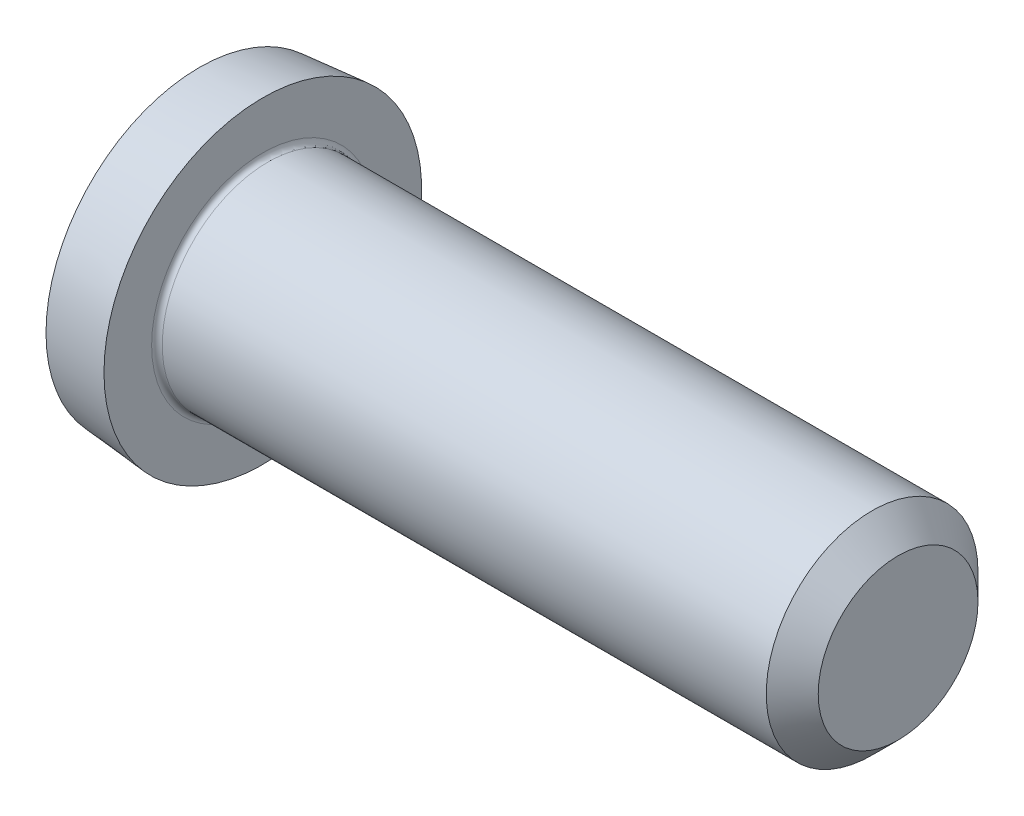
ISO-10303-21;
HEADER;
FILE_DESCRIPTION(('STEP AP214'),'2;1');
FILE_NAME('part.step','',(''),(''),'','','');
FILE_SCHEMA(('AUTOMOTIVE_DESIGN { 1 0 10303 214 1 1 1 1 }'));
ENDSEC;
DATA;
#1=APPLICATION_CONTEXT('core data for automotive mechanical design processes');
#2=APPLICATION_PROTOCOL_DEFINITION('international standard','automotive_design',2000,#1);
#3=PRODUCT_CONTEXT('',#1,'mechanical');
#4=PRODUCT('Part','Part','',(#3));
#5=PRODUCT_RELATED_PRODUCT_CATEGORY('part','',(#4));
#6=PRODUCT_DEFINITION_FORMATION('','',#4);
#7=PRODUCT_DEFINITION_CONTEXT('part definition',#1,'design');
#8=PRODUCT_DEFINITION('design','',#6,#7);
#9=PRODUCT_DEFINITION_SHAPE('','',#8);
#10=(LENGTH_UNIT() NAMED_UNIT(*) SI_UNIT(.MILLI.,.METRE.));
#11=(NAMED_UNIT(*) PLANE_ANGLE_UNIT() SI_UNIT($,.RADIAN.));
#12=(NAMED_UNIT(*) SI_UNIT($,.STERADIAN.) SOLID_ANGLE_UNIT());
#13=UNCERTAINTY_MEASURE_WITH_UNIT(LENGTH_MEASURE(1.E-05),#10,'distance_accuracy_value','');
#14=(GEOMETRIC_REPRESENTATION_CONTEXT(3) GLOBAL_UNCERTAINTY_ASSIGNED_CONTEXT((#13)) GLOBAL_UNIT_ASSIGNED_CONTEXT((#10,
#11,#12)) REPRESENTATION_CONTEXT('',''));
#15=CARTESIAN_POINT('',(0.,0.,0.));
#16=DIRECTION('',(0.,0.,1.));
#17=DIRECTION('',(1.,0.,0.));
#18=AXIS2_PLACEMENT_3D('',#15,#16,#17);
#19=CARTESIAN_POINT('',(0.,-1.5,-1.5));
#20=DIRECTION('',(1.,0.,0.));
#21=DIRECTION('',(0.,1.,0.));
#22=AXIS2_PLACEMENT_3D('',#19,#20,#21);
#23=PLANE('',#22);
#24=CARTESIAN_POINT('',(0.,0.,0.));
#25=DIRECTION('',(1.,0.,0.));
#26=DIRECTION('',(0.,0.,1.));
#27=AXIS2_PLACEMENT_3D('',#24,#25,#26);
#28=CIRCLE('',#27,1.5);
#29=CARTESIAN_POINT('',(0.,0.,1.5));
#30=VERTEX_POINT('',#29);
#31=EDGE_CURVE('E632',#30,#30,#28,.T.);
#32=ORIENTED_EDGE('',*,*,#31,.T.);
#33=EDGE_LOOP('',(#32));
#34=FACE_BOUND('',#33,.T.);
#35=CARTESIAN_POINT('',(0.,0.,0.));
#36=DIRECTION('',(-1.,0.,0.));
#37=DIRECTION('',(0.,0.,-1.));
#38=AXIS2_PLACEMENT_3D('',#35,#36,#37);
#39=CIRCLE('',#38,1.05000000000005);
#40=CARTESIAN_POINT('',(0.,0.,-1.05000000000005));
#41=VERTEX_POINT('',#40);
#42=EDGE_CURVE('E133',#41,#41,#39,.F.);
#43=ORIENTED_EDGE('',*,*,#42,.F.);
#44=EDGE_LOOP('',(#43));
#45=FACE_BOUND('',#44,.T.);
#46=ADVANCED_FACE('F16',(#34,#45),#23,.T.);
#47=CARTESIAN_POINT('',(6.,-0.764320600490568,-0.7545));
#48=DIRECTION('',(1.,0.,0.));
#49=DIRECTION('',(0.,1.,0.));
#50=AXIS2_PLACEMENT_3D('',#47,#48,#49);
#51=PLANE('',#50);
#52=CARTESIAN_POINT('',(6.,0.,0.));
#53=DIRECTION('',(1.,0.,0.));
#54=DIRECTION('',(0.,-1.4192495452193E-07,0.99999999999999));
#55=AXIS2_PLACEMENT_3D('',#52,#53,#54);
#56=CIRCLE('',#55,0.754500000000001);
#57=CARTESIAN_POINT('',(6.,-1.07082378186797E-07,0.754499999999994));
#58=VERTEX_POINT('',#57);
#59=EDGE_CURVE('E130',#58,#58,#56,.T.);
#60=ORIENTED_EDGE('',*,*,#59,.T.);
#61=EDGE_LOOP('',(#60));
#62=FACE_BOUND('',#61,.T.);
#63=ADVANCED_FACE('F461',(#62),#51,.T.);
#64=CARTESIAN_POINT('',(-0.3,0.3,0.689640081011209));
#65=DIRECTION('',(1.,0.,0.));
#66=DIRECTION('',(0.,0.,-1.));
#67=AXIS2_PLACEMENT_3D('',#64,#65,#66);
#68=PLANE('',#67);
#69=DIRECTION('',(0.,0.999999999999716,7.54348143014324E-07));
#70=VECTOR('',#69,1.);
#71=CARTESIAN_POINT('',(-0.3,0.3,0.3));
#72=LINE('',#71,#70);
#73=CARTESIAN_POINT('',(-0.3,0.689640861164422,0.30000029392486));
#74=VERTEX_POINT('',#73);
#75=CARTESIAN_POINT('',(-0.3,0.3,0.3));
#76=VERTEX_POINT('',#75);
#77=EDGE_CURVE('E117',#74,#76,#72,.F.);
#78=ORIENTED_EDGE('',*,*,#77,.F.);
#79=CARTESIAN_POINT('',(-0.3,0.,0.));
#80=DIRECTION('',(1.,0.,0.));
#81=DIRECTION('',(0.,0.916993976829315,0.398901048455325));
#82=AXIS2_PLACEMENT_3D('',#79,#80,#81);
#83=CIRCLE('',#82,0.752066115702479);
#84=CARTESIAN_POINT('',(-0.3,0.300000000278641,0.689640081651749));
#85=VERTEX_POINT('',#84);
#86=EDGE_CURVE('E108',#74,#85,#83,.T.);
#87=ORIENTED_EDGE('',*,*,#86,.T.);
#88=DIRECTION('',(0.,0.,-1.));
#89=VECTOR('',#88,1.);
#90=CARTESIAN_POINT('',(-0.3,0.3,0.689640081011209));
#91=LINE('',#90,#89);
#92=EDGE_CURVE('E116',#76,#85,#91,.F.);
#93=ORIENTED_EDGE('',*,*,#92,.F.);
#94=EDGE_LOOP('',(#78,#87,#93));
#95=FACE_BOUND('',#94,.T.);
#96=ADVANCED_FACE('F129',(#95),#68,.T.);
#97=CARTESIAN_POINT('',(-0.3,-0.68964008177296,0.68964008177296));
#98=DIRECTION('',(1.,0.,0.));
#99=DIRECTION('',(0.,0.,-1.));
#100=AXIS2_PLACEMENT_3D('',#97,#98,#99);
#101=PLANE('',#100);
#102=DIRECTION('',(0.,0.,1.));
#103=VECTOR('',#102,1.);
#104=CARTESIAN_POINT('',(-0.3,-0.3,0.3));
#105=LINE('',#104,#103);
#106=CARTESIAN_POINT('',(-0.3,-0.3,0.689640069740939));
#107=VERTEX_POINT('',#106);
#108=CARTESIAN_POINT('',(-0.3,-0.3,0.3));
#109=VERTEX_POINT('',#108);
#110=EDGE_CURVE('E142',#107,#109,#105,.F.);
#111=ORIENTED_EDGE('',*,*,#110,.F.);
#112=CARTESIAN_POINT('',(-0.3,0.,0.));
#113=DIRECTION('',(1.,0.,0.));
#114=DIRECTION('',(0.,-0.398901104753233,0.916993952339191));
#115=AXIS2_PLACEMENT_3D('',#112,#113,#114);
#116=CIRCLE('',#115,0.752066115702479);
#117=CARTESIAN_POINT('',(-0.3,-0.689640081651749,0.300000000278641));
#118=VERTEX_POINT('',#117);
#119=EDGE_CURVE('E146',#107,#118,#116,.T.);
#120=ORIENTED_EDGE('',*,*,#119,.T.);
#121=DIRECTION('',(0.,1.,0.));
#122=VECTOR('',#121,1.);
#123=CARTESIAN_POINT('',(-0.3,-0.689640081011209,0.3));
#124=LINE('',#123,#122);
#125=EDGE_CURVE('E151',#109,#118,#124,.F.);
#126=ORIENTED_EDGE('',*,*,#125,.F.);
#127=EDGE_LOOP('',(#111,#120,#126));
#128=FACE_BOUND('',#127,.T.);
#129=ADVANCED_FACE('F458',(#128),#101,.T.);
#130=CARTESIAN_POINT('',(-0.3,-0.68964008177296,-0.299999999999999));
#131=DIRECTION('',(1.,0.,0.));
#132=DIRECTION('',(0.,0.,-1.));
#133=AXIS2_PLACEMENT_3D('',#130,#131,#132);
#134=PLANE('',#133);
#135=DIRECTION('',(0.,-1.,0.));
#136=VECTOR('',#135,1.);
#137=CARTESIAN_POINT('',(-0.3,-0.3,-0.3));
#138=LINE('',#137,#136);
#139=CARTESIAN_POINT('',(-0.3,-0.689640069740939,-0.3));
#140=VERTEX_POINT('',#139);
#141=CARTESIAN_POINT('',(-0.3,-0.3,-0.3));
#142=VERTEX_POINT('',#141);
#143=EDGE_CURVE('E156',#140,#142,#138,.F.);
#144=ORIENTED_EDGE('',*,*,#143,.F.);
#145=CARTESIAN_POINT('',(-0.3,0.,0.));
#146=DIRECTION('',(1.,0.,0.));
#147=DIRECTION('',(0.,-0.916993952339191,-0.398901104753232));
#148=AXIS2_PLACEMENT_3D('',#145,#146,#147);
#149=CIRCLE('',#148,0.752066115702479);
#150=CARTESIAN_POINT('',(-0.3,-0.300000000278641,-0.689640081651749));
#151=VERTEX_POINT('',#150);
#152=EDGE_CURVE('E160',#140,#151,#149,.T.);
#153=ORIENTED_EDGE('',*,*,#152,.T.);
#154=DIRECTION('',(0.,0.,1.));
#155=VECTOR('',#154,1.);
#156=CARTESIAN_POINT('',(-0.3,-0.3,-0.689640081011209));
#157=LINE('',#156,#155);
#158=EDGE_CURVE('E165',#142,#151,#157,.F.);
#159=ORIENTED_EDGE('',*,*,#158,.F.);
#160=EDGE_LOOP('',(#144,#153,#159));
#161=FACE_BOUND('',#160,.T.);
#162=ADVANCED_FACE('F453',(#161),#134,.T.);
#163=CARTESIAN_POINT('',(-0.3,0.3,-0.3));
#164=DIRECTION('',(1.,0.,0.));
#165=DIRECTION('',(0.,0.,-1.));
#166=AXIS2_PLACEMENT_3D('',#163,#164,#165);
#167=PLANE('',#166);
#168=DIRECTION('',(0.,0.,-1.));
#169=VECTOR('',#168,1.);
#170=CARTESIAN_POINT('',(-0.3,0.3,-0.3));
#171=LINE('',#170,#169);
#172=CARTESIAN_POINT('',(-0.3,0.3,-0.68964006974095));
#173=VERTEX_POINT('',#172);
#174=CARTESIAN_POINT('',(-0.3,0.3,-0.3));
#175=VERTEX_POINT('',#174);
#176=EDGE_CURVE('E170',#173,#175,#171,.F.);
#177=ORIENTED_EDGE('',*,*,#176,.F.);
#178=CARTESIAN_POINT('',(-0.3,0.,0.));
#179=DIRECTION('',(1.,0.,0.));
#180=DIRECTION('',(0.,0.398901104753227,-0.916993952339193));
#181=AXIS2_PLACEMENT_3D('',#178,#179,#180);
#182=CIRCLE('',#181,0.752066115702479);
#183=CARTESIAN_POINT('',(-0.3,0.689640081651749,-0.300000000278641));
#184=VERTEX_POINT('',#183);
#185=EDGE_CURVE('E174',#173,#184,#182,.T.);
#186=ORIENTED_EDGE('',*,*,#185,.T.);
#187=DIRECTION('',(0.,-1.,0.));
#188=VECTOR('',#187,1.);
#189=CARTESIAN_POINT('',(-0.3,0.689640081011209,-0.3));
#190=LINE('',#189,#188);
#191=EDGE_CURVE('E179',#175,#184,#190,.F.);
#192=ORIENTED_EDGE('',*,*,#191,.F.);
#193=EDGE_LOOP('',(#177,#186,#192));
#194=FACE_BOUND('',#193,.T.);
#195=ADVANCED_FACE('F209',(#194),#167,.T.);
#196=CARTESIAN_POINT('',(-0.600001164699373,0.3,-0.3));
#197=DIRECTION('',(0.,0.,1.));
#198=DIRECTION('',(1.,0.,0.));
#199=AXIS2_PLACEMENT_3D('',#196,#197,#198);
#200=PLANE('',#199);
#201=ORIENTED_EDGE('',*,*,#191,.T.);
#202=CARTESIAN_POINT('',(-0.299999999577395,0.689640081011209,-0.3));
#203=CARTESIAN_POINT('',(-0.396705481590353,0.776796461526106,-0.3));
#204=CARTESIAN_POINT('',(-0.50163502884518,0.868720599742607,-0.3));
#205=CARTESIAN_POINT('',(-0.600001164699373,0.953940210455807,-0.3));
#206=B_SPLINE_CURVE_WITH_KNOTS('',3,(#202,#203,#204,#205),.UNSPECIFIED.,.F.,.F.,(4,4),(0.,1.),.UNSPECIFIED.);
#207=CARTESIAN_POINT('',(-0.600001164699373,0.953940210455807,-0.3));
#208=VERTEX_POINT('',#207);
#209=EDGE_CURVE('E184',#184,#208,#206,.T.);
#210=ORIENTED_EDGE('',*,*,#209,.T.);
#211=DIRECTION('',(1.78104871667038E-06,-0.999999999998414,0.));
#212=VECTOR('',#211,1.);
#213=CARTESIAN_POINT('',(-0.600001164699373,0.953940210455807,-0.3));
#214=LINE('',#213,#212);
#215=CARTESIAN_POINT('',(-0.6,0.3,-0.3));
#216=VERTEX_POINT('',#215);
#217=EDGE_CURVE('E196',#216,#208,#214,.F.);
#218=ORIENTED_EDGE('',*,*,#217,.F.);
#219=DIRECTION('',(1.,0.,0.));
#220=VECTOR('',#219,1.);
#221=CARTESIAN_POINT('',(-0.6,0.3,-0.3));
#222=LINE('',#221,#220);
#223=EDGE_CURVE('E443',#175,#216,#222,.F.);
#224=ORIENTED_EDGE('',*,*,#223,.F.);
#225=EDGE_LOOP('',(#201,#210,#218,#224));
#226=FACE_BOUND('',#225,.T.);
#227=ADVANCED_FACE('F198',(#226),#200,.T.);
#228=CARTESIAN_POINT('',(-0.6,0.3,-0.3));
#229=DIRECTION('',(0.,-1.,0.));
#230=DIRECTION('',(0.,0.,-1.));
#231=AXIS2_PLACEMENT_3D('',#228,#229,#230);
#232=PLANE('',#231);
#233=DIRECTION('',(3.92954935951545E-09,0.,-1.));
#234=VECTOR('',#233,1.);
#235=CARTESIAN_POINT('',(-0.6,0.3,-0.3));
#236=LINE('',#235,#234);
#237=CARTESIAN_POINT('',(-0.599999997430314,0.3,-0.953939196964448));
#238=VERTEX_POINT('',#237);
#239=EDGE_CURVE('E439',#238,#216,#236,.F.);
#240=ORIENTED_EDGE('',*,*,#239,.F.);
#241=CARTESIAN_POINT('',(-0.599999997430314,0.3,-0.953939196964447));
#242=CARTESIAN_POINT('',(-0.501517924686095,0.3,-0.868619142990885));
#243=CARTESIAN_POINT('',(-0.396633008931762,0.3,-0.776731153475633));
#244=CARTESIAN_POINT('',(-0.299999993324866,0.3,-0.68964006974095));
#245=B_SPLINE_CURVE_WITH_KNOTS('',3,(#241,#242,#243,#244),.UNSPECIFIED.,.F.,.F.,(4,4),(0.,1.),.UNSPECIFIED.);
#246=EDGE_CURVE('E436',#238,#173,#245,.T.);
#247=ORIENTED_EDGE('',*,*,#246,.T.);
#248=ORIENTED_EDGE('',*,*,#176,.T.);
#249=ORIENTED_EDGE('',*,*,#223,.T.);
#250=EDGE_LOOP('',(#240,#247,#248,#249));
#251=FACE_BOUND('',#250,.T.);
#252=ADVANCED_FACE('F208',(#251),#232,.T.);
#253=CARTESIAN_POINT('',(-0.6,-0.3,-0.953939201416946));
#254=DIRECTION('',(0.,1.,0.));
#255=DIRECTION('',(0.,0.,1.));
#256=AXIS2_PLACEMENT_3D('',#253,#254,#255);
#257=PLANE('',#256);
#258=ORIENTED_EDGE('',*,*,#158,.T.);
#259=CARTESIAN_POINT('',(-0.299999999577395,-0.3,-0.689640081011209));
#260=CARTESIAN_POINT('',(-0.396705104930861,-0.3,-0.776796135206676));
#261=CARTESIAN_POINT('',(-0.501634245142488,-0.3,-0.868719920780782));
#262=CARTESIAN_POINT('',(-0.599999999999298,-0.3,-0.953939201416414));
#263=B_SPLINE_CURVE_WITH_KNOTS('',3,(#259,#260,#261,#262),.UNSPECIFIED.,.F.,.F.,(4,4),(0.,1.),.UNSPECIFIED.);
#264=CARTESIAN_POINT('',(-0.599999999999299,-0.3,-0.953939201416414));
#265=VERTEX_POINT('',#264);
#266=EDGE_CURVE('E234',#151,#265,#263,.T.);
#267=ORIENTED_EDGE('',*,*,#266,.T.);
#268=DIRECTION('',(-1.07280604640477E-12,0.,1.));
#269=VECTOR('',#268,1.);
#270=CARTESIAN_POINT('',(-0.599999999999299,-0.3,-0.953939201416414));
#271=LINE('',#270,#269);
#272=CARTESIAN_POINT('',(-0.6,-0.3,-0.3));
#273=VERTEX_POINT('',#272);
#274=EDGE_CURVE('E239',#273,#265,#271,.F.);
#275=ORIENTED_EDGE('',*,*,#274,.F.);
#276=DIRECTION('',(1.,0.,0.));
#277=VECTOR('',#276,1.);
#278=CARTESIAN_POINT('',(-0.6,-0.3,-0.3));
#279=LINE('',#278,#277);
#280=EDGE_CURVE('E246',#142,#273,#279,.F.);
#281=ORIENTED_EDGE('',*,*,#280,.F.);
#282=EDGE_LOOP('',(#258,#267,#275,#281));
#283=FACE_BOUND('',#282,.T.);
#284=ADVANCED_FACE('F214',(#283),#257,.T.);
#285=CARTESIAN_POINT('',(-0.6,-0.95393920141695,-0.3));
#286=DIRECTION('',(0.,0.,1.));
#287=DIRECTION('',(1.,0.,0.));
#288=AXIS2_PLACEMENT_3D('',#285,#286,#287);
#289=PLANE('',#288);
#290=DIRECTION('',(3.92954901996613E-09,-1.,0.));
#291=VECTOR('',#290,1.);
#292=CARTESIAN_POINT('',(-0.6,-0.3,-0.3));
#293=LINE('',#292,#291);
#294=CARTESIAN_POINT('',(-0.599999997430314,-0.953939196964448,-0.3));
#295=VERTEX_POINT('',#294);
#296=EDGE_CURVE('E251',#295,#273,#293,.F.);
#297=ORIENTED_EDGE('',*,*,#296,.F.);
#298=CARTESIAN_POINT('',(-0.599999997430314,-0.953939196964448,-0.3));
#299=CARTESIAN_POINT('',(-0.501517924686132,-0.868619142990916,-0.3));
#300=CARTESIAN_POINT('',(-0.396633008931719,-0.77673115347559,-0.3));
#301=CARTESIAN_POINT('',(-0.299999993324859,-0.689640069740939,-0.3));
#302=B_SPLINE_CURVE_WITH_KNOTS('',3,(#298,#299,#300,#301),.UNSPECIFIED.,.F.,.F.,(4,4),(0.,1.),.UNSPECIFIED.);
#303=EDGE_CURVE('E255',#295,#140,#302,.T.);
#304=ORIENTED_EDGE('',*,*,#303,.T.);
#305=ORIENTED_EDGE('',*,*,#143,.T.);
#306=ORIENTED_EDGE('',*,*,#280,.T.);
#307=EDGE_LOOP('',(#297,#304,#305,#306));
#308=FACE_BOUND('',#307,.T.);
#309=ADVANCED_FACE('F268',(#308),#289,.T.);
#310=CARTESIAN_POINT('',(-0.299999997375761,-0.953939201416946,0.3));
#311=DIRECTION('',(0.,0.,-1.));
#312=DIRECTION('',(-1.,0.,0.));
#313=AXIS2_PLACEMENT_3D('',#310,#311,#312);
#314=PLANE('',#313);
#315=ORIENTED_EDGE('',*,*,#125,.T.);
#316=CARTESIAN_POINT('',(-0.299999999577395,-0.689640081011209,0.3));
#317=CARTESIAN_POINT('',(-0.396705104930887,-0.776796135206708,0.3));
#318=CARTESIAN_POINT('',(-0.501634245142549,-0.868719920780855,0.3));
#319=CARTESIAN_POINT('',(-0.599999999999385,-0.953939201416518,0.3));
#320=B_SPLINE_CURVE_WITH_KNOTS('',3,(#316,#317,#318,#319),.UNSPECIFIED.,.F.,.F.,(4,4),(0.,1.),.UNSPECIFIED.);
#321=CARTESIAN_POINT('',(-0.599999999999385,-0.953939201416518,0.3));
#322=VERTEX_POINT('',#321);
#323=EDGE_CURVE('E297',#118,#322,#320,.T.);
#324=ORIENTED_EDGE('',*,*,#323,.T.);
#325=DIRECTION('',(-9.40212040669201E-13,1.,0.));
#326=VECTOR('',#325,1.);
#327=CARTESIAN_POINT('',(-0.599999999999385,-0.953939201416518,0.3));
#328=LINE('',#327,#326);
#329=CARTESIAN_POINT('',(-0.6,-0.3,0.3));
#330=VERTEX_POINT('',#329);
#331=EDGE_CURVE('E288',#330,#322,#328,.F.);
#332=ORIENTED_EDGE('',*,*,#331,.F.);
#333=DIRECTION('',(1.,0.,0.));
#334=VECTOR('',#333,1.);
#335=CARTESIAN_POINT('',(-0.6,-0.3,0.3));
#336=LINE('',#335,#334);
#337=EDGE_CURVE('E296',#109,#330,#336,.F.);
#338=ORIENTED_EDGE('',*,*,#337,.F.);
#339=EDGE_LOOP('',(#315,#324,#332,#338));
#340=FACE_BOUND('',#339,.T.);
#341=ADVANCED_FACE('F277',(#340),#314,.T.);
#342=CARTESIAN_POINT('',(-0.6,-0.3,0.3));
#343=DIRECTION('',(0.,1.,0.));
#344=DIRECTION('',(0.,0.,1.));
#345=AXIS2_PLACEMENT_3D('',#342,#343,#344);
#346=PLANE('',#345);
#347=DIRECTION('',(3.92954885019148E-09,0.,1.));
#348=VECTOR('',#347,1.);
#349=CARTESIAN_POINT('',(-0.6,-0.3,0.3));
#350=LINE('',#349,#348);
#351=CARTESIAN_POINT('',(-0.599999997430314,-0.3,0.953939196964448));
#352=VERTEX_POINT('',#351);
#353=EDGE_CURVE('E302',#352,#330,#350,.F.);
#354=ORIENTED_EDGE('',*,*,#353,.F.);
#355=CARTESIAN_POINT('',(-0.599999997430314,-0.3,0.953939196964448));
#356=CARTESIAN_POINT('',(-0.501517924686125,-0.3,0.86861914299091));
#357=CARTESIAN_POINT('',(-0.396633008931724,-0.3,0.776731153475595));
#358=CARTESIAN_POINT('',(-0.299999993324859,-0.3,0.689640069740939));
#359=B_SPLINE_CURVE_WITH_KNOTS('',3,(#355,#356,#357,#358),.UNSPECIFIED.,.F.,.F.,(4,4),(0.,1.),.UNSPECIFIED.);
#360=EDGE_CURVE('E306',#352,#107,#359,.T.);
#361=ORIENTED_EDGE('',*,*,#360,.T.);
#362=ORIENTED_EDGE('',*,*,#110,.T.);
#363=ORIENTED_EDGE('',*,*,#337,.T.);
#364=EDGE_LOOP('',(#354,#361,#362,#363));
#365=FACE_BOUND('',#364,.T.);
#366=ADVANCED_FACE('F281',(#365),#346,.T.);
#367=CARTESIAN_POINT('',(-0.6,0.3,0.953939201416946));
#368=DIRECTION('',(0.,-1.,0.));
#369=DIRECTION('',(0.,0.,-1.));
#370=AXIS2_PLACEMENT_3D('',#367,#368,#369);
#371=PLANE('',#370);
#372=ORIENTED_EDGE('',*,*,#92,.T.);
#373=CARTESIAN_POINT('',(-0.299999999577395,0.3,0.689640081011209));
#374=CARTESIAN_POINT('',(-0.396705101686366,0.3,0.776796132784767));
#375=CARTESIAN_POINT('',(-0.501634238108706,0.3,0.868719915659607));
#376=CARTESIAN_POINT('',(-0.599999990095487,0.3,0.953939194380678));
#377=B_SPLINE_CURVE_WITH_KNOTS('',3,(#373,#374,#375,#376),.UNSPECIFIED.,.F.,.F.,(4,4),(0.,1.),.UNSPECIFIED.);
#378=CARTESIAN_POINT('',(-0.599999990095487,0.3,0.953939194380678));
#379=VERTEX_POINT('',#378);
#380=EDGE_CURVE('E110',#85,#379,#377,.T.);
#381=ORIENTED_EDGE('',*,*,#380,.T.);
#382=DIRECTION('',(-1.51459239723251E-08,0.,-1.));
#383=VECTOR('',#382,1.);
#384=CARTESIAN_POINT('',(-0.599999990095487,0.3,0.953939194380678));
#385=LINE('',#384,#383);
#386=CARTESIAN_POINT('',(-0.6,0.3,0.3));
#387=VERTEX_POINT('',#386);
#388=EDGE_CURVE('E329',#387,#379,#385,.F.);
#389=ORIENTED_EDGE('',*,*,#388,.F.);
#390=DIRECTION('',(1.,0.,0.));
#391=VECTOR('',#390,1.);
#392=CARTESIAN_POINT('',(-0.6,0.3,0.3));
#393=LINE('',#392,#391);
#394=EDGE_CURVE('E481',#76,#387,#393,.F.);
#395=ORIENTED_EDGE('',*,*,#394,.F.);
#396=EDGE_LOOP('',(#372,#381,#389,#395));
#397=FACE_BOUND('',#396,.T.);
#398=ADVANCED_FACE('F331',(#397),#371,.T.);
#399=CARTESIAN_POINT('',(-0.299999947832484,0.3,0.3));
#400=DIRECTION('',(0.,0.,-1.));
#401=DIRECTION('',(-1.,0.,0.));
#402=AXIS2_PLACEMENT_3D('',#399,#400,#401);
#403=PLANE('',#402);
#404=DIRECTION('',(3.92954935951545E-09,1.,0.));
#405=VECTOR('',#404,1.);
#406=CARTESIAN_POINT('',(-0.6,0.3,0.3));
#407=LINE('',#406,#405);
#408=CARTESIAN_POINT('',(-0.599999997430314,0.953939196964448,0.3));
#409=VERTEX_POINT('',#408);
#410=EDGE_CURVE('E125',#409,#387,#407,.F.);
#411=ORIENTED_EDGE('',*,*,#410,.F.);
#412=CARTESIAN_POINT('',(-0.599999997430314,0.953939196964448,0.3));
#413=CARTESIAN_POINT('',(-0.501518128458072,0.868619401237488,0.3));
#414=CARTESIAN_POINT('',(-0.39663345389311,0.776731715628595,0.3));
#415=CARTESIAN_POINT('',(-0.300000574260692,0.689640861164421,0.3));
#416=B_SPLINE_CURVE_WITH_KNOTS('',3,(#412,#413,#414,#415),.UNSPECIFIED.,.F.,.F.,(4,4),(0.,1.),.UNSPECIFIED.);
#417=EDGE_CURVE('E38',#409,#74,#416,.T.);
#418=ORIENTED_EDGE('',*,*,#417,.T.);
#419=ORIENTED_EDGE('',*,*,#77,.T.);
#420=ORIENTED_EDGE('',*,*,#394,.T.);
#421=EDGE_LOOP('',(#411,#418,#419,#420));
#422=FACE_BOUND('',#421,.T.);
#423=ADVANCED_FACE('F122',(#422),#403,.T.);
#424=CARTESIAN_POINT('',(-0.6,-1.44750680188441,1.44750691295075));
#425=DIRECTION('',(-1.,0.,0.));
#426=DIRECTION('',(0.,1.,0.));
#427=AXIS2_PLACEMENT_3D('',#424,#425,#426);
#428=PLANE('',#427);
#429=CARTESIAN_POINT('',(-0.6,0.,0.));
#430=DIRECTION('',(-1.,0.,0.));
#431=DIRECTION('',(0.,0.,-1.));
#432=AXIS2_PLACEMENT_3D('',#429,#430,#431);
#433=CIRCLE('',#432,1.4475068018844);
#434=CARTESIAN_POINT('',(-0.6,0.,-1.4475068018844));
#435=VERTEX_POINT('',#434);
#436=EDGE_CURVE('E126',#435,#435,#433,.F.);
#437=ORIENTED_EDGE('',*,*,#436,.F.);
#438=EDGE_LOOP('',(#437));
#439=FACE_BOUND('',#438,.T.);
#440=ORIENTED_EDGE('',*,*,#217,.T.);
#441=CARTESIAN_POINT('',(-0.6,0.,0.));
#442=DIRECTION('',(1.,0.,0.));
#443=DIRECTION('',(0.,0.953939292230458,-0.299999711231281));
#444=AXIS2_PLACEMENT_3D('',#441,#442,#443);
#445=CIRCLE('',#444,1.);
#446=EDGE_CURVE('E355',#208,#409,#445,.T.);
#447=ORIENTED_EDGE('',*,*,#446,.T.);
#448=ORIENTED_EDGE('',*,*,#410,.T.);
#449=ORIENTED_EDGE('',*,*,#388,.T.);
#450=CARTESIAN_POINT('',(-0.6,0.,0.));
#451=DIRECTION('',(1.,0.,0.));
#452=DIRECTION('',(0.,6.28368695557434E-10,1.));
#453=AXIS2_PLACEMENT_3D('',#450,#451,#452);
#454=CIRCLE('',#453,1.);
#455=EDGE_CURVE('E357',#379,#352,#454,.T.);
#456=ORIENTED_EDGE('',*,*,#455,.T.);
#457=ORIENTED_EDGE('',*,*,#353,.T.);
#458=ORIENTED_EDGE('',*,*,#331,.T.);
#459=CARTESIAN_POINT('',(-0.6,0.,0.));
#460=DIRECTION('',(1.,0.,0.));
#461=DIRECTION('',(0.,-0.953939201416945,0.300000000000003));
#462=AXIS2_PLACEMENT_3D('',#459,#460,#461);
#463=CIRCLE('',#462,1.);
#464=EDGE_CURVE('E362',#322,#295,#463,.T.);
#465=ORIENTED_EDGE('',*,*,#464,.T.);
#466=ORIENTED_EDGE('',*,*,#296,.T.);
#467=ORIENTED_EDGE('',*,*,#274,.T.);
#468=CARTESIAN_POINT('',(-0.6,0.,0.));
#469=DIRECTION('',(1.,0.,0.));
#470=DIRECTION('',(0.,0.,-1.));
#471=AXIS2_PLACEMENT_3D('',#468,#469,#470);
#472=CIRCLE('',#471,1.);
#473=EDGE_CURVE('E367',#265,#238,#472,.T.);
#474=ORIENTED_EDGE('',*,*,#473,.T.);
#475=ORIENTED_EDGE('',*,*,#239,.T.);
#476=EDGE_LOOP('',(#440,#447,#448,#449,#456,#457,#458,#465,#466,#467,#474,#475));
#477=FACE_BOUND('',#476,.T.);
#478=ADVANCED_FACE('F343',(#439,#477),#428,.T.);
#479=CARTESIAN_POINT('',(0.0500000000000474,0.,0.));
#480=DIRECTION('',(1.,0.,0.));
#481=DIRECTION('',(0.,1.92328497912594E-10,1.));
#482=AXIS2_PLACEMENT_3D('',#479,#480,#481);
#483=TOROIDAL_SURFACE('',#482,1.05000000000005,0.0500000000000474);
#484=CARTESIAN_POINT('',(0.05,0.,0.));
#485=DIRECTION('',(-1.,0.,0.));
#486=DIRECTION('',(0.,0.,-1.));
#487=AXIS2_PLACEMENT_3D('',#484,#485,#486);
#488=CIRCLE('',#487,0.999999999999999);
#489=CARTESIAN_POINT('',(0.05,0.,-0.999999999999999));
#490=VERTEX_POINT('',#489);
#491=EDGE_CURVE('E27',#490,#490,#488,.F.);
#492=ORIENTED_EDGE('',*,*,#491,.F.);
#493=EDGE_LOOP('',(#492));
#494=FACE_BOUND('',#493,.T.);
#495=ORIENTED_EDGE('',*,*,#42,.T.);
#496=EDGE_LOOP('',(#495));
#497=FACE_BOUND('',#496,.T.);
#498=ADVANCED_FACE('F525',(#494,#497),#483,.F.);
#499=CARTESIAN_POINT('',(6.,0.,0.));
#500=DIRECTION('',(1.,0.,0.));
#501=DIRECTION('',(0.,7.69313624256337E-10,1.));
#502=AXIS2_PLACEMENT_3D('',#499,#500,#501);
#503=CYLINDRICAL_SURFACE('',#502,1.);
#504=CARTESIAN_POINT('',(5.7545,0.,0.));
#505=DIRECTION('',(-1.,0.,0.));
#506=DIRECTION('',(0.,0.,-1.));
#507=AXIS2_PLACEMENT_3D('',#504,#505,#506);
#508=CIRCLE('',#507,1.);
#509=CARTESIAN_POINT('',(5.7545,0.,-1.));
#510=VERTEX_POINT('',#509);
#511=EDGE_CURVE('E10',#510,#510,#508,.F.);
#512=ORIENTED_EDGE('',*,*,#511,.F.);
#513=EDGE_LOOP('',(#512));
#514=FACE_BOUND('',#513,.T.);
#515=ORIENTED_EDGE('',*,*,#491,.T.);
#516=EDGE_LOOP('',(#515));
#517=FACE_BOUND('',#516,.T.);
#518=ADVANCED_FACE('F532',(#514,#517),#503,.T.);
#519=CARTESIAN_POINT('',(5.7545,0.,0.));
#520=DIRECTION('',(-1.,0.,0.));
#521=DIRECTION('',(0.,0.,-1.));
#522=AXIS2_PLACEMENT_3D('',#519,#520,#521);
#523=CONICAL_SURFACE('',#522,1.,0.785398163397446);
#524=ORIENTED_EDGE('',*,*,#59,.F.);
#525=EDGE_LOOP('',(#524));
#526=FACE_BOUND('',#525,.T.);
#527=ORIENTED_EDGE('',*,*,#511,.T.);
#528=EDGE_LOOP('',(#527));
#529=FACE_BOUND('',#528,.T.);
#530=ADVANCED_FACE('F539',(#526,#529),#523,.T.);
#531=CARTESIAN_POINT('',(0.,0.,0.));
#532=DIRECTION('',(1.,0.,0.));
#533=DIRECTION('',(0.,1.419758032365E-07,0.99999999999999));
#534=AXIS2_PLACEMENT_3D('',#531,#532,#533);
#535=CONICAL_SURFACE('',#534,1.5,0.0872664625997913);
#536=ORIENTED_EDGE('',*,*,#31,.F.);
#537=EDGE_LOOP('',(#536));
#538=FACE_BOUND('',#537,.T.);
#539=ORIENTED_EDGE('',*,*,#436,.T.);
#540=EDGE_LOOP('',(#539));
#541=FACE_BOUND('',#540,.T.);
#542=ADVANCED_FACE('F547',(#538,#541),#535,.T.);
#543=CARTESIAN_POINT('',(-0.6,0.,0.));
#544=DIRECTION('',(-1.,0.,0.));
#545=DIRECTION('',(0.,0.,-1.));
#546=AXIS2_PLACEMENT_3D('',#543,#544,#545);
#547=CONICAL_SURFACE('',#546,1.,0.690659995381576);
#548=ORIENTED_EDGE('',*,*,#266,.F.);
#549=ORIENTED_EDGE('',*,*,#152,.F.);
#550=ORIENTED_EDGE('',*,*,#303,.F.);
#551=ORIENTED_EDGE('',*,*,#464,.F.);
#552=ORIENTED_EDGE('',*,*,#323,.F.);
#553=ORIENTED_EDGE('',*,*,#119,.F.);
#554=ORIENTED_EDGE('',*,*,#360,.F.);
#555=ORIENTED_EDGE('',*,*,#455,.F.);
#556=ORIENTED_EDGE('',*,*,#380,.F.);
#557=ORIENTED_EDGE('',*,*,#86,.F.);
#558=ORIENTED_EDGE('',*,*,#417,.F.);
#559=ORIENTED_EDGE('',*,*,#446,.F.);
#560=ORIENTED_EDGE('',*,*,#209,.F.);
#561=ORIENTED_EDGE('',*,*,#185,.F.);
#562=ORIENTED_EDGE('',*,*,#246,.F.);
#563=ORIENTED_EDGE('',*,*,#473,.F.);
#564=EDGE_LOOP('',(#548,#549,#550,#551,#552,#553,#554,#555,#556,#557,#558,#559,#560,#561,#562,#563));
#565=FACE_BOUND('',#564,.T.);
#566=CARTESIAN_POINT('',(0.61,0.,0.));
#567=VERTEX_POINT('',#566);
#568=VERTEX_LOOP('',#567);
#569=FACE_BOUND('',#568,.T.);
#570=ADVANCED_FACE('F18',(#565,#569),#547,.F.);
#571=CLOSED_SHELL('',(#46,#63,#96,#129,#162,#195,#227,#252,#284,#309,#341,#366,#398,#423,#478,
#498,#518,#530,#542,#570));
#572=MANIFOLD_SOLID_BREP('B1',#571);
#573=ADVANCED_BREP_SHAPE_REPRESENTATION('',(#18,#572),#14);
#574=SHAPE_DEFINITION_REPRESENTATION(#9,#573);
ENDSEC;
END-ISO-10303-21;
